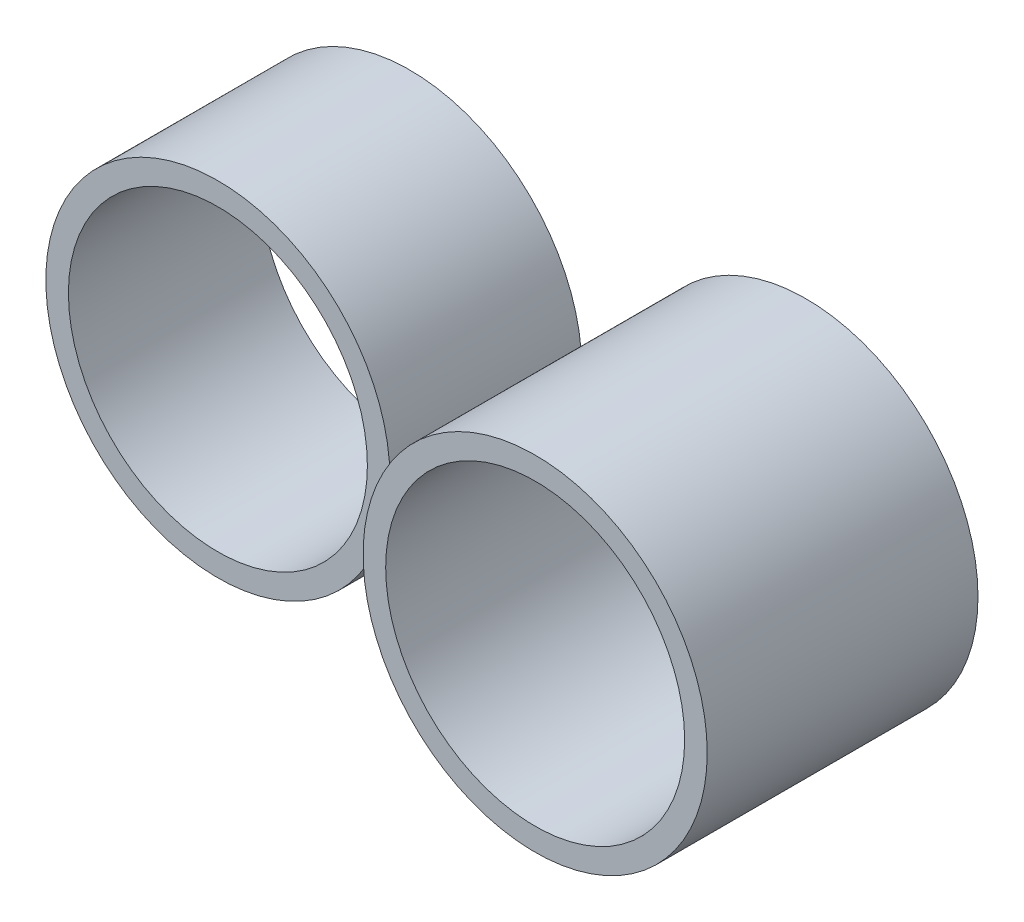
ISO-10303-21;
HEADER;
FILE_DESCRIPTION(('STEP AP214'),'2;1');
FILE_NAME('part.step','',(''),(''),'','','');
FILE_SCHEMA(('AUTOMOTIVE_DESIGN { 1 0 10303 214 1 1 1 1 }'));
ENDSEC;
DATA;
#1=APPLICATION_CONTEXT('core data for automotive mechanical design processes');
#2=APPLICATION_PROTOCOL_DEFINITION('international standard','automotive_design',2000,#1);
#3=PRODUCT_CONTEXT('',#1,'mechanical');
#4=PRODUCT('Part','Part','',(#3));
#5=PRODUCT_RELATED_PRODUCT_CATEGORY('part','',(#4));
#6=PRODUCT_DEFINITION_FORMATION('','',#4);
#7=PRODUCT_DEFINITION_CONTEXT('part definition',#1,'design');
#8=PRODUCT_DEFINITION('design','',#6,#7);
#9=PRODUCT_DEFINITION_SHAPE('','',#8);
#10=(LENGTH_UNIT() NAMED_UNIT(*) SI_UNIT(.MILLI.,.METRE.));
#11=(NAMED_UNIT(*) PLANE_ANGLE_UNIT() SI_UNIT($,.RADIAN.));
#12=(NAMED_UNIT(*) SI_UNIT($,.STERADIAN.) SOLID_ANGLE_UNIT());
#13=UNCERTAINTY_MEASURE_WITH_UNIT(LENGTH_MEASURE(1.E-05),#10,'distance_accuracy_value','');
#14=(GEOMETRIC_REPRESENTATION_CONTEXT(3) GLOBAL_UNCERTAINTY_ASSIGNED_CONTEXT((#13)) GLOBAL_UNIT_ASSIGNED_CONTEXT((#10,
#11,#12)) REPRESENTATION_CONTEXT('',''));
#15=CARTESIAN_POINT('',(0.,0.,0.));
#16=DIRECTION('',(0.,0.,1.));
#17=DIRECTION('',(1.,0.,0.));
#18=AXIS2_PLACEMENT_3D('',#15,#16,#17);
#19=CARTESIAN_POINT('',(7.02407639981427,0.,9.6));
#20=DIRECTION('',(0.,0.,-1.));
#21=DIRECTION('',(-1.,0.,0.));
#22=AXIS2_PLACEMENT_3D('',#19,#20,#21);
#23=CYLINDRICAL_SURFACE('',#22,6.1);
#24=CARTESIAN_POINT('',(7.02407639981427,0.,9.6));
#25=DIRECTION('',(0.,0.,1.));
#26=DIRECTION('',(1.,0.,0.));
#27=AXIS2_PLACEMENT_3D('',#24,#25,#26);
#28=CIRCLE('',#27,6.1);
#29=CARTESIAN_POINT('',(13.1240763998143,0.,9.6));
#30=VERTEX_POINT('',#29);
#31=EDGE_CURVE('E46',#30,#30,#28,.F.);
#32=ORIENTED_EDGE('',*,*,#31,.T.);
#33=EDGE_LOOP('',(#32));
#34=FACE_BOUND('',#33,.T.);
#35=CARTESIAN_POINT('',(7.02407639981427,0.,0.));
#36=DIRECTION('',(0.,0.,1.));
#37=DIRECTION('',(1.,0.,0.));
#38=AXIS2_PLACEMENT_3D('',#35,#36,#37);
#39=CIRCLE('',#38,6.1);
#40=CARTESIAN_POINT('',(13.1240763998143,0.,0.));
#41=VERTEX_POINT('',#40);
#42=EDGE_CURVE('E52',#41,#41,#39,.F.);
#43=ORIENTED_EDGE('',*,*,#42,.F.);
#44=EDGE_LOOP('',(#43));
#45=FACE_BOUND('',#44,.T.);
#46=ADVANCED_FACE('F39',(#34,#45),#23,.T.);
#47=CARTESIAN_POINT('',(7.02407639981427,0.,9.6));
#48=DIRECTION('',(0.,0.,-1.));
#49=DIRECTION('',(-1.,0.,0.));
#50=AXIS2_PLACEMENT_3D('',#47,#48,#49);
#51=CYLINDRICAL_SURFACE('',#50,5.3);
#52=CARTESIAN_POINT('',(7.02407639981427,0.,9.6));
#53=DIRECTION('',(0.,0.,1.));
#54=DIRECTION('',(1.,0.,0.));
#55=AXIS2_PLACEMENT_3D('',#52,#53,#54);
#56=CIRCLE('',#55,5.3);
#57=CARTESIAN_POINT('',(12.3240763998143,0.,9.6));
#58=VERTEX_POINT('',#57);
#59=EDGE_CURVE('E11',#58,#58,#56,.F.);
#60=ORIENTED_EDGE('',*,*,#59,.F.);
#61=EDGE_LOOP('',(#60));
#62=FACE_BOUND('',#61,.T.);
#63=CARTESIAN_POINT('',(7.02407639981427,0.,0.));
#64=DIRECTION('',(0.,0.,1.));
#65=DIRECTION('',(1.,0.,0.));
#66=AXIS2_PLACEMENT_3D('',#63,#64,#65);
#67=CIRCLE('',#66,5.3);
#68=CARTESIAN_POINT('',(12.3240763998143,0.,0.));
#69=VERTEX_POINT('',#68);
#70=EDGE_CURVE('E42',#69,#69,#67,.F.);
#71=ORIENTED_EDGE('',*,*,#70,.T.);
#72=EDGE_LOOP('',(#71));
#73=FACE_BOUND('',#72,.T.);
#74=ADVANCED_FACE('F59',(#62,#73),#51,.F.);
#75=CARTESIAN_POINT('',(0.,0.,9.6));
#76=DIRECTION('',(0.,0.,1.));
#77=DIRECTION('',(1.,0.,0.));
#78=AXIS2_PLACEMENT_3D('',#75,#76,#77);
#79=PLANE('',#78);
#80=ORIENTED_EDGE('',*,*,#31,.F.);
#81=EDGE_LOOP('',(#80));
#82=FACE_BOUND('',#81,.T.);
#83=ORIENTED_EDGE('',*,*,#59,.T.);
#84=EDGE_LOOP('',(#83));
#85=FACE_BOUND('',#84,.T.);
#86=ADVANCED_FACE('F63',(#82,#85),#79,.T.);
#87=CARTESIAN_POINT('',(0.,0.,0.));
#88=DIRECTION('',(0.,0.,1.));
#89=DIRECTION('',(1.,0.,0.));
#90=AXIS2_PLACEMENT_3D('',#87,#88,#89);
#91=PLANE('',#90);
#92=ORIENTED_EDGE('',*,*,#42,.T.);
#93=EDGE_LOOP('',(#92));
#94=FACE_BOUND('',#93,.T.);
#95=ORIENTED_EDGE('',*,*,#70,.F.);
#96=EDGE_LOOP('',(#95));
#97=FACE_BOUND('',#96,.T.);
#98=ADVANCED_FACE('F61',(#94,#97),#91,.F.);
#99=CLOSED_SHELL('',(#46,#74,#86,#98));
#100=MANIFOLD_SOLID_BREP('B2',#99);
#101=CARTESIAN_POINT('',(-7.02407639981427,0.,6.8));
#102=DIRECTION('',(0.,0.,-1.));
#103=DIRECTION('',(-1.,0.,0.));
#104=AXIS2_PLACEMENT_3D('',#101,#102,#103);
#105=CYLINDRICAL_SURFACE('',#104,5.3);
#106=CARTESIAN_POINT('',(-7.02407639981427,0.,6.8));
#107=DIRECTION('',(0.,0.,1.));
#108=DIRECTION('',(1.,0.,0.));
#109=AXIS2_PLACEMENT_3D('',#106,#107,#108);
#110=CIRCLE('',#109,5.3);
#111=CARTESIAN_POINT('',(-1.72407639981427,0.,6.8));
#112=VERTEX_POINT('',#111);
#113=EDGE_CURVE('E108',#112,#112,#110,.T.);
#114=ORIENTED_EDGE('',*,*,#113,.T.);
#115=EDGE_LOOP('',(#114));
#116=FACE_BOUND('',#115,.T.);
#117=CARTESIAN_POINT('',(-7.02407639981427,0.,0.));
#118=DIRECTION('',(0.,0.,1.));
#119=DIRECTION('',(1.,0.,0.));
#120=AXIS2_PLACEMENT_3D('',#117,#118,#119);
#121=CIRCLE('',#120,5.3);
#122=CARTESIAN_POINT('',(-1.72407639981427,0.,0.));
#123=VERTEX_POINT('',#122);
#124=EDGE_CURVE('E114',#123,#123,#121,.T.);
#125=ORIENTED_EDGE('',*,*,#124,.F.);
#126=EDGE_LOOP('',(#125));
#127=FACE_BOUND('',#126,.T.);
#128=ADVANCED_FACE('F101',(#116,#127),#105,.F.);
#129=CARTESIAN_POINT('',(-7.02407639981427,0.,6.8));
#130=DIRECTION('',(0.,0.,-1.));
#131=DIRECTION('',(-1.,0.,0.));
#132=AXIS2_PLACEMENT_3D('',#129,#130,#131);
#133=CYLINDRICAL_SURFACE('',#132,6.1);
#134=CARTESIAN_POINT('',(-7.02407639981427,0.,6.8));
#135=DIRECTION('',(0.,0.,1.));
#136=DIRECTION('',(1.,0.,0.));
#137=AXIS2_PLACEMENT_3D('',#134,#135,#136);
#138=CIRCLE('',#137,6.1);
#139=CARTESIAN_POINT('',(-0.924076399814268,0.,6.8));
#140=VERTEX_POINT('',#139);
#141=EDGE_CURVE('E38',#140,#140,#138,.T.);
#142=ORIENTED_EDGE('',*,*,#141,.F.);
#143=EDGE_LOOP('',(#142));
#144=FACE_BOUND('',#143,.T.);
#145=CARTESIAN_POINT('',(-7.02407639981427,0.,0.));
#146=DIRECTION('',(0.,0.,1.));
#147=DIRECTION('',(1.,0.,0.));
#148=AXIS2_PLACEMENT_3D('',#145,#146,#147);
#149=CIRCLE('',#148,6.1);
#150=CARTESIAN_POINT('',(-0.924076399814268,0.,0.));
#151=VERTEX_POINT('',#150);
#152=EDGE_CURVE('E104',#151,#151,#149,.T.);
#153=ORIENTED_EDGE('',*,*,#152,.T.);
#154=EDGE_LOOP('',(#153));
#155=FACE_BOUND('',#154,.T.);
#156=ADVANCED_FACE('F121',(#144,#155),#133,.T.);
#157=CARTESIAN_POINT('',(0.,0.,6.8));
#158=DIRECTION('',(0.,0.,1.));
#159=DIRECTION('',(1.,0.,0.));
#160=AXIS2_PLACEMENT_3D('',#157,#158,#159);
#161=PLANE('',#160);
#162=ORIENTED_EDGE('',*,*,#113,.F.);
#163=EDGE_LOOP('',(#162));
#164=FACE_BOUND('',#163,.T.);
#165=ORIENTED_EDGE('',*,*,#141,.T.);
#166=EDGE_LOOP('',(#165));
#167=FACE_BOUND('',#166,.T.);
#168=ADVANCED_FACE('F125',(#164,#167),#161,.T.);
#169=CARTESIAN_POINT('',(0.,0.,0.));
#170=DIRECTION('',(0.,0.,1.));
#171=DIRECTION('',(1.,0.,0.));
#172=AXIS2_PLACEMENT_3D('',#169,#170,#171);
#173=PLANE('',#172);
#174=ORIENTED_EDGE('',*,*,#124,.T.);
#175=EDGE_LOOP('',(#174));
#176=FACE_BOUND('',#175,.T.);
#177=ORIENTED_EDGE('',*,*,#152,.F.);
#178=EDGE_LOOP('',(#177));
#179=FACE_BOUND('',#178,.T.);
#180=ADVANCED_FACE('F123',(#176,#179),#173,.F.);
#181=CLOSED_SHELL('',(#128,#156,#168,#180));
#182=MANIFOLD_SOLID_BREP('B6',#181);
#183=ADVANCED_BREP_SHAPE_REPRESENTATION('',(#18,#100,#182),#14);
#184=SHAPE_DEFINITION_REPRESENTATION(#9,#183);
ENDSEC;
END-ISO-10303-21;
